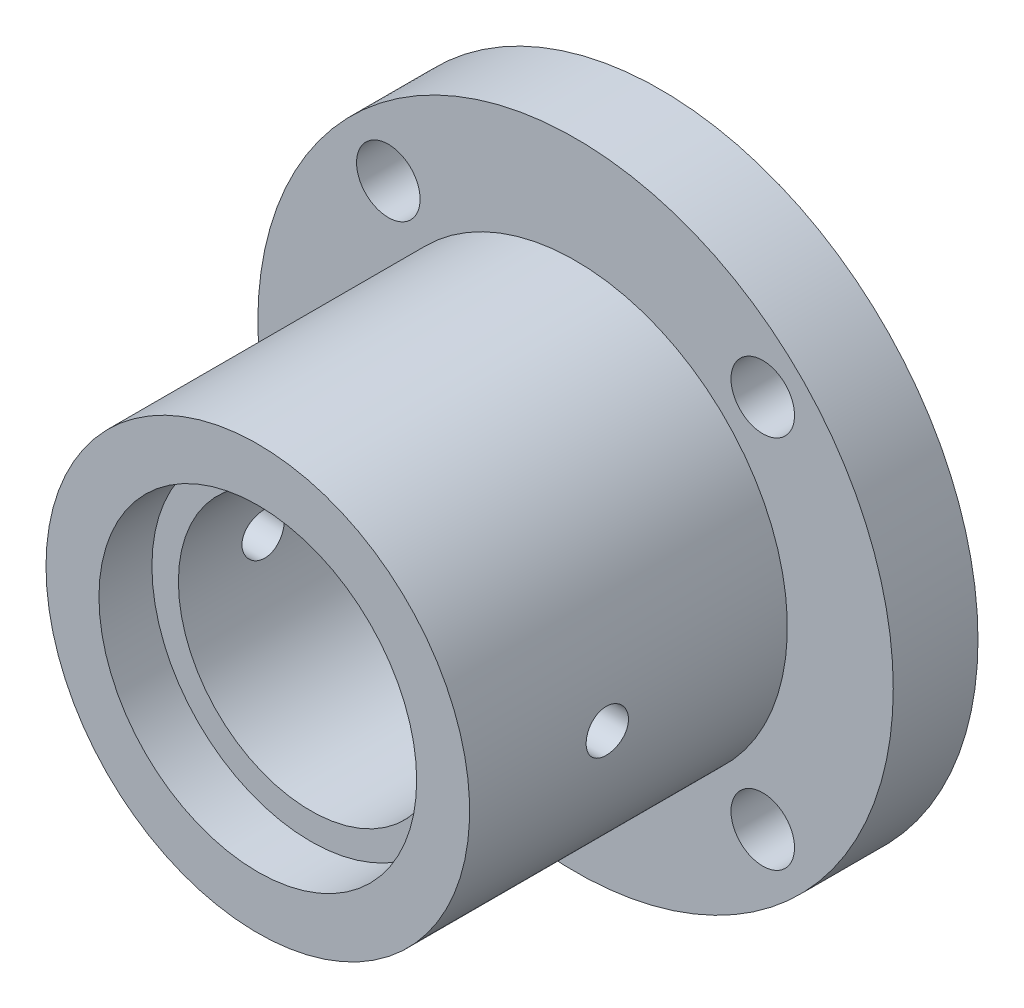
ISO-10303-21;
HEADER;
FILE_DESCRIPTION(('STEP AP214'),'2;1');
FILE_NAME('part.step','',(''),(''),'','','');
FILE_SCHEMA(('AUTOMOTIVE_DESIGN { 1 0 10303 214 1 1 1 1 }'));
ENDSEC;
DATA;
#1=APPLICATION_CONTEXT('core data for automotive mechanical design processes');
#2=APPLICATION_PROTOCOL_DEFINITION('international standard','automotive_design',2000,#1);
#3=PRODUCT_CONTEXT('',#1,'mechanical');
#4=PRODUCT('Part','Part','',(#3));
#5=PRODUCT_RELATED_PRODUCT_CATEGORY('part','',(#4));
#6=PRODUCT_DEFINITION_FORMATION('','',#4);
#7=PRODUCT_DEFINITION_CONTEXT('part definition',#1,'design');
#8=PRODUCT_DEFINITION('design','',#6,#7);
#9=PRODUCT_DEFINITION_SHAPE('','',#8);
#10=(LENGTH_UNIT() NAMED_UNIT(*) SI_UNIT(.MILLI.,.METRE.));
#11=(NAMED_UNIT(*) PLANE_ANGLE_UNIT() SI_UNIT($,.RADIAN.));
#12=(NAMED_UNIT(*) SI_UNIT($,.STERADIAN.) SOLID_ANGLE_UNIT());
#13=UNCERTAINTY_MEASURE_WITH_UNIT(LENGTH_MEASURE(1.E-05),#10,'distance_accuracy_value','');
#14=(GEOMETRIC_REPRESENTATION_CONTEXT(3) GLOBAL_UNCERTAINTY_ASSIGNED_CONTEXT((#13)) GLOBAL_UNIT_ASSIGNED_CONTEXT((#10,
#11,#12)) REPRESENTATION_CONTEXT('',''));
#15=CARTESIAN_POINT('',(0.,0.,0.));
#16=DIRECTION('',(0.,0.,1.));
#17=DIRECTION('',(1.,0.,0.));
#18=AXIS2_PLACEMENT_3D('',#15,#16,#17);
#19=CARTESIAN_POINT('',(0.,0.,0.));
#20=DIRECTION('',(0.,0.,1.));
#21=DIRECTION('',(1.,0.,0.));
#22=AXIS2_PLACEMENT_3D('',#19,#20,#21);
#23=PLANE('',#22);
#24=CARTESIAN_POINT('',(17.67767,-17.67767,0.));
#25=DIRECTION('',(0.,0.,1.));
#26=DIRECTION('',(1.,0.,0.));
#27=AXIS2_PLACEMENT_3D('',#24,#25,#26);
#28=CIRCLE('',#27,3.);
#29=CARTESIAN_POINT('',(20.67767,-17.67767,0.));
#30=VERTEX_POINT('',#29);
#31=EDGE_CURVE('E184',#30,#30,#28,.T.);
#32=ORIENTED_EDGE('',*,*,#31,.T.);
#33=EDGE_LOOP('',(#32));
#34=FACE_BOUND('',#33,.T.);
#35=CARTESIAN_POINT('',(-17.67767,-17.67767,0.));
#36=DIRECTION('',(0.,0.,1.));
#37=DIRECTION('',(1.,0.,0.));
#38=AXIS2_PLACEMENT_3D('',#35,#36,#37);
#39=CIRCLE('',#38,3.);
#40=CARTESIAN_POINT('',(-14.67767,-17.67767,0.));
#41=VERTEX_POINT('',#40);
#42=EDGE_CURVE('E188',#41,#41,#39,.T.);
#43=ORIENTED_EDGE('',*,*,#42,.T.);
#44=EDGE_LOOP('',(#43));
#45=FACE_BOUND('',#44,.T.);
#46=CARTESIAN_POINT('',(-17.67767,17.67767,0.));
#47=DIRECTION('',(0.,0.,1.));
#48=DIRECTION('',(1.,0.,0.));
#49=AXIS2_PLACEMENT_3D('',#46,#47,#48);
#50=CIRCLE('',#49,3.);
#51=CARTESIAN_POINT('',(-14.67767,17.67767,0.));
#52=VERTEX_POINT('',#51);
#53=EDGE_CURVE('E183',#52,#52,#50,.T.);
#54=ORIENTED_EDGE('',*,*,#53,.T.);
#55=EDGE_LOOP('',(#54));
#56=FACE_BOUND('',#55,.T.);
#57=CARTESIAN_POINT('',(17.67767,17.67767,0.));
#58=DIRECTION('',(0.,0.,1.));
#59=DIRECTION('',(1.,0.,0.));
#60=AXIS2_PLACEMENT_3D('',#57,#58,#59);
#61=CIRCLE('',#60,3.);
#62=CARTESIAN_POINT('',(20.67767,17.67767,0.));
#63=VERTEX_POINT('',#62);
#64=EDGE_CURVE('E85',#63,#63,#61,.T.);
#65=ORIENTED_EDGE('',*,*,#64,.T.);
#66=EDGE_LOOP('',(#65));
#67=FACE_BOUND('',#66,.T.);
#68=CARTESIAN_POINT('',(0.,0.,0.));
#69=DIRECTION('',(0.,0.,1.));
#70=DIRECTION('',(1.,0.,0.));
#71=AXIS2_PLACEMENT_3D('',#68,#69,#70);
#72=CIRCLE('',#71,12.5);
#73=CARTESIAN_POINT('',(12.5,0.,0.));
#74=VERTEX_POINT('',#73);
#75=EDGE_CURVE('E79',#74,#74,#72,.T.);
#76=ORIENTED_EDGE('',*,*,#75,.T.);
#77=EDGE_LOOP('',(#76));
#78=FACE_BOUND('',#77,.T.);
#79=CARTESIAN_POINT('',(0.,0.,0.));
#80=DIRECTION('',(0.,0.,-1.));
#81=DIRECTION('',(-1.,0.,0.));
#82=AXIS2_PLACEMENT_3D('',#79,#80,#81);
#83=CIRCLE('',#82,30.);
#84=CARTESIAN_POINT('',(-30.,0.,0.));
#85=VERTEX_POINT('',#84);
#86=EDGE_CURVE('E10',#85,#85,#83,.T.);
#87=ORIENTED_EDGE('',*,*,#86,.T.);
#88=EDGE_LOOP('',(#87));
#89=FACE_BOUND('',#88,.T.);
#90=ADVANCED_FACE('F49',(#34,#45,#56,#67,#78,#89),#23,.F.);
#91=CARTESIAN_POINT('',(0.,0.,0.));
#92=DIRECTION('',(0.,0.,-1.));
#93=DIRECTION('',(-1.,0.,0.));
#94=AXIS2_PLACEMENT_3D('',#91,#92,#93);
#95=CYLINDRICAL_SURFACE('',#94,30.);
#96=ORIENTED_EDGE('',*,*,#86,.F.);
#97=EDGE_LOOP('',(#96));
#98=FACE_BOUND('',#97,.T.);
#99=CARTESIAN_POINT('',(0.,0.,8.));
#100=DIRECTION('',(0.,0.,-1.));
#101=DIRECTION('',(-1.,0.,0.));
#102=AXIS2_PLACEMENT_3D('',#99,#100,#101);
#103=CIRCLE('',#102,30.);
#104=CARTESIAN_POINT('',(-30.,0.,8.));
#105=VERTEX_POINT('',#104);
#106=EDGE_CURVE('E63',#105,#105,#103,.T.);
#107=ORIENTED_EDGE('',*,*,#106,.T.);
#108=EDGE_LOOP('',(#107));
#109=FACE_BOUND('',#108,.T.);
#110=ADVANCED_FACE('F151',(#98,#109),#95,.T.);
#111=CARTESIAN_POINT('',(30.,0.,8.));
#112=DIRECTION('',(0.,0.,-1.));
#113=DIRECTION('',(-1.,0.,0.));
#114=AXIS2_PLACEMENT_3D('',#111,#112,#113);
#115=PLANE('',#114);
#116=CARTESIAN_POINT('',(17.67767,-17.67767,8.));
#117=DIRECTION('',(0.,0.,-1.));
#118=DIRECTION('',(-1.,0.,0.));
#119=AXIS2_PLACEMENT_3D('',#116,#117,#118);
#120=CIRCLE('',#119,3.);
#121=CARTESIAN_POINT('',(14.67767,-17.67767,8.));
#122=VERTEX_POINT('',#121);
#123=EDGE_CURVE('E93',#122,#122,#120,.F.);
#124=ORIENTED_EDGE('',*,*,#123,.F.);
#125=EDGE_LOOP('',(#124));
#126=FACE_BOUND('',#125,.T.);
#127=CARTESIAN_POINT('',(-17.67767,-17.67767,8.));
#128=DIRECTION('',(0.,0.,-1.));
#129=DIRECTION('',(-1.,0.,0.));
#130=AXIS2_PLACEMENT_3D('',#127,#128,#129);
#131=CIRCLE('',#130,3.);
#132=CARTESIAN_POINT('',(-20.67767,-17.67767,8.));
#133=VERTEX_POINT('',#132);
#134=EDGE_CURVE('E89',#133,#133,#131,.F.);
#135=ORIENTED_EDGE('',*,*,#134,.F.);
#136=EDGE_LOOP('',(#135));
#137=FACE_BOUND('',#136,.T.);
#138=CARTESIAN_POINT('',(-17.67767,17.67767,8.));
#139=DIRECTION('',(0.,0.,-1.));
#140=DIRECTION('',(-1.,0.,0.));
#141=AXIS2_PLACEMENT_3D('',#138,#139,#140);
#142=CIRCLE('',#141,3.);
#143=CARTESIAN_POINT('',(-20.67767,17.67767,8.));
#144=VERTEX_POINT('',#143);
#145=EDGE_CURVE('E84',#144,#144,#142,.F.);
#146=ORIENTED_EDGE('',*,*,#145,.F.);
#147=EDGE_LOOP('',(#146));
#148=FACE_BOUND('',#147,.T.);
#149=CARTESIAN_POINT('',(17.67767,17.67767,8.));
#150=DIRECTION('',(0.,0.,-1.));
#151=DIRECTION('',(-1.,0.,0.));
#152=AXIS2_PLACEMENT_3D('',#149,#150,#151);
#153=CIRCLE('',#152,3.);
#154=CARTESIAN_POINT('',(14.67767,17.67767,8.));
#155=VERTEX_POINT('',#154);
#156=EDGE_CURVE('E80',#155,#155,#153,.F.);
#157=ORIENTED_EDGE('',*,*,#156,.F.);
#158=EDGE_LOOP('',(#157));
#159=FACE_BOUND('',#158,.T.);
#160=ORIENTED_EDGE('',*,*,#106,.F.);
#161=EDGE_LOOP('',(#160));
#162=FACE_BOUND('',#161,.T.);
#163=CARTESIAN_POINT('',(0.,0.,8.));
#164=DIRECTION('',(0.,0.,-1.));
#165=DIRECTION('',(-1.,0.,0.));
#166=AXIS2_PLACEMENT_3D('',#163,#164,#165);
#167=CIRCLE('',#166,20.);
#168=CARTESIAN_POINT('',(-20.,0.,8.));
#169=VERTEX_POINT('',#168);
#170=EDGE_CURVE('E71',#169,#169,#167,.T.);
#171=ORIENTED_EDGE('',*,*,#170,.T.);
#172=EDGE_LOOP('',(#171));
#173=FACE_BOUND('',#172,.T.);
#174=ADVANCED_FACE('F145',(#126,#137,#148,#159,#162,#173),#115,.F.);
#175=CARTESIAN_POINT('',(0.,0.,0.));
#176=DIRECTION('',(0.,0.,-1.));
#177=DIRECTION('',(-1.,0.,0.));
#178=AXIS2_PLACEMENT_3D('',#175,#176,#177);
#179=CYLINDRICAL_SURFACE('',#178,20.);
#180=CARTESIAN_POINT('',(-20.,0.,27.));
#181=CARTESIAN_POINT('',(-19.9999987104154,-0.112040707583114,26.9999951481993));
#182=CARTESIAN_POINT('',(-19.9990485119241,-0.224155490335545,26.9905534622071));
#183=CARTESIAN_POINT('',(-19.9953493518948,-0.445276796993674,26.9530312594191));
#184=CARTESIAN_POINT('',(-19.9925984086805,-0.554279758337656,26.9249302079508));
#185=CARTESIAN_POINT('',(-19.9856082912614,-0.765943350906829,26.8509155188043));
#186=CARTESIAN_POINT('',(-19.9813700160142,-0.86860776922982,26.8050126389631));
#187=CARTESIAN_POINT('',(-19.9718791478861,-1.06475232192081,26.6967181841367));
#188=CARTESIAN_POINT('',(-19.9666267567626,-1.15823427755815,26.6343298879997));
#189=CARTESIAN_POINT('',(-19.9556748868265,-1.33371910134816,26.4945946046755));
#190=CARTESIAN_POINT('',(-19.9499740314773,-1.41568428966978,26.4172004011959));
#191=CARTESIAN_POINT('',(-19.9387791381252,-1.56548504286197,26.2497509314739));
#192=CARTESIAN_POINT('',(-19.9332851096983,-1.63331995416531,26.1596950799152));
#193=CARTESIAN_POINT('',(-19.9231118310557,-1.75306794088723,25.9692429366328));
#194=CARTESIAN_POINT('',(-19.9184343342181,-1.80494693090976,25.8688251118103));
#195=CARTESIAN_POINT('',(-19.9104407509305,-1.89109276948552,25.66064882819));
#196=CARTESIAN_POINT('',(-19.9071246308444,-1.92536005318258,25.5528905508321));
#197=CARTESIAN_POINT('',(-19.9022416814596,-1.97519808320379,25.333476398268));
#198=CARTESIAN_POINT('',(-19.9006690079619,-1.99083130600759,25.2218348462956));
#199=CARTESIAN_POINT('',(-19.8994328612105,-2.00315057027072,24.9975022732084));
#200=CARTESIAN_POINT('',(-19.8997693377749,-1.99983710974161,24.8848112797559));
#201=CARTESIAN_POINT('',(-19.9023081379787,-1.97440856050536,24.6620093806134));
#202=CARTESIAN_POINT('',(-19.904503691813,-1.9523616882491,24.5518906013426));
#203=CARTESIAN_POINT('',(-19.9105026857484,-1.89019828830117,24.3369240735978));
#204=CARTESIAN_POINT('',(-19.9143061475698,-1.85008151651149,24.2320763963499));
#205=CARTESIAN_POINT('',(-19.9231001890414,-1.75284178776302,24.0304128254022));
#206=CARTESIAN_POINT('',(-19.9280928781631,-1.69568856543996,23.9336116210214));
#207=CARTESIAN_POINT('',(-19.9387010346576,-1.56602005470646,23.7509495701762));
#208=CARTESIAN_POINT('',(-19.9443165202557,-1.49350431667301,23.6650890440365));
#209=CARTESIAN_POINT('',(-19.9555677062598,-1.33478822482414,23.5063492120219));
#210=CARTESIAN_POINT('',(-19.9612033866599,-1.24852895770273,23.4335287962384));
#211=CARTESIAN_POINT('',(-19.9718365815704,-1.06497896347423,23.3033927341792));
#212=CARTESIAN_POINT('',(-19.9768340953651,-0.967688223999202,23.246077105287));
#213=CARTESIAN_POINT('',(-19.9856295133419,-0.764796211384729,23.1485799593795));
#214=CARTESIAN_POINT('',(-19.9894272082954,-0.659193492779806,23.1084014303639));
#215=CARTESIAN_POINT('',(-19.9953929488282,-0.442694434659864,23.0463621665765));
#216=CARTESIAN_POINT('',(-19.9975610431413,-0.3317982535532,23.0245008840188));
#217=CARTESIAN_POINT('',(-20.0000170333662,-0.108370198183806,22.9997913845305));
#218=CARTESIAN_POINT('',(-20.0003129653547,0.00415260421098516,22.996861903495));
#219=CARTESIAN_POINT('',(-19.9990128351359,0.228087586631401,23.0098857260975));
#220=CARTESIAN_POINT('',(-19.9974167984894,0.339499781640941,23.0258387746306));
#221=CARTESIAN_POINT('',(-19.9925172307839,0.557816413669351,23.0761073908432));
#222=CARTESIAN_POINT('',(-19.9892172383608,0.66472969794404,23.110384908956));
#223=CARTESIAN_POINT('',(-19.9812799772122,0.871288642767564,23.1962903480745));
#224=CARTESIAN_POINT('',(-19.9766426785051,0.970934140314235,23.2479186580788));
#225=CARTESIAN_POINT('',(-19.9665295066084,1.16049636034429,23.3672616773278));
#226=CARTESIAN_POINT('',(-19.9610508720688,1.25037931949784,23.4350297778516));
#227=CARTESIAN_POINT('',(-19.9498786573904,1.41752324662376,23.5846521354819));
#228=CARTESIAN_POINT('',(-19.9441850718594,1.49478389769835,23.6665067461406));
#229=CARTESIAN_POINT('',(-19.9332004828151,1.63477221977429,23.842333149318));
#230=CARTESIAN_POINT('',(-19.9279110027795,1.69744655735909,23.9363475130852));
#231=CARTESIAN_POINT('',(-19.9183566492178,1.80611651748766,24.1336147202934));
#232=CARTESIAN_POINT('',(-19.9140917616808,1.85211236810777,24.2368674373768));
#233=CARTESIAN_POINT('',(-19.907078952681,1.92603041736895,24.4494974789316));
#234=CARTESIAN_POINT('',(-19.9043283689958,1.95398434962372,24.5588636801822));
#235=CARTESIAN_POINT('',(-19.9006473056575,1.99112801425893,24.7807663959215));
#236=CARTESIAN_POINT('',(-19.8997167738037,2.00031828479904,24.8933028193913));
#237=CARTESIAN_POINT('',(-19.8997822621512,1.99966627694251,25.1178213767134));
#238=CARTESIAN_POINT('',(-19.9007698017402,1.98990777918623,25.2298037657656));
#239=CARTESIAN_POINT('',(-19.9045420777909,1.95181090592731,25.4505298343366));
#240=CARTESIAN_POINT('',(-19.9073268162744,1.92347250952432,25.559273510212));
#241=CARTESIAN_POINT('',(-19.9143773652637,1.84904337259501,25.7704346980957));
#242=CARTESIAN_POINT('',(-19.9186429708072,1.80295508868183,25.8728530832595));
#243=CARTESIAN_POINT('',(-19.9281750367872,1.69434310982209,26.0685137833421));
#244=CARTESIAN_POINT('',(-19.933441491619,1.63181950691083,26.1617561496413));
#245=CARTESIAN_POINT('',(-19.944409744194,1.49179711257066,26.3368473489439));
#246=CARTESIAN_POINT('',(-19.950113294535,1.41423589778053,26.4186461527342));
#247=CARTESIAN_POINT('',(-19.9612970945757,1.24646339845022,26.5681044653993));
#248=CARTESIAN_POINT('',(-19.9667772904595,1.15624908821651,26.6357605827143));
#249=CARTESIAN_POINT('',(-19.9769112413832,0.965482868322578,26.7551469077092));
#250=CARTESIAN_POINT('',(-19.9815628805362,0.864905498693527,26.8068365818904));
#251=CARTESIAN_POINT('',(-19.9894925849979,0.656516558201101,26.8925248456477));
#252=CARTESIAN_POINT('',(-19.9927721981931,0.548713299651219,26.9265433819071));
#253=CARTESIAN_POINT('',(-19.9967642754747,0.366916522811409,26.9674412341696));
#254=CARTESIAN_POINT('',(-19.9979720138367,0.294085105689017,26.9796340885987));
#255=CARTESIAN_POINT('',(-19.9995902990157,0.147513161634625,26.9959150521235));
#256=CARTESIAN_POINT('',(-20.0000008491205,0.0737726384531154,27.0000031946437));
#257=CARTESIAN_POINT('',(-20.,0.,27.));
#258=B_SPLINE_CURVE_WITH_KNOTS('',3,(#180,#181,#182,#183,#184,#185,#186,#187,#188,#189,#190,
#191,#192,#193,#194,#195,#196,#197,#198,#199,#200,#201,#202,#203,#204,#205,#206,#207,#208,#209,
#210,#211,#212,#213,#214,#215,#216,#217,#218,#219,#220,#221,#222,#223,#224,#225,#226,#227,#228,
#229,#230,#231,#232,#233,#234,#235,#236,#237,#238,#239,#240,#241,#242,#243,#244,#245,#246,#247,
#248,#249,#250,#251,#252,#253,#254,#255,#256,#257),.UNSPECIFIED.,.T.,.F.,(4,2,2,2,2,2,2,2,2,2,2,
2,2,2,2,2,2,2,2,2,2,2,2,2,2,2,2,2,2,2,2,2,2,2,2,2,2,2,4),(0.,0.335852732536947,
0.672075685670974,1.00809577146441,1.34404907516557,1.68107713724589,2.01812078441412,
2.35587950944444,2.69362988885008,3.03024464090393,3.36685054511553,3.70223594882221,
4.03762588323268,4.3736152274579,4.70961440662251,5.04709468392414,5.38457533959544,
5.72211481387164,6.0596441935088,6.39572377215516,6.73179881038287,7.0671787058861,
7.40256612098934,7.73907881497398,8.0755999562046,8.41333287217198,8.75106116950749,
9.08819381186007,9.42531678479171,9.76095258587914,10.0965887645208,10.432178507256,
10.7677663707792,11.1047783485531,11.4418710527392,11.7798126205249,12.1173718959059,
12.338513344647,12.5596538813806),.UNSPECIFIED.);
#259=CARTESIAN_POINT('',(-20.,0.,27.));
#260=VERTEX_POINT('',#259);
#261=EDGE_CURVE('E131',#260,#260,#258,.T.);
#262=ORIENTED_EDGE('',*,*,#261,.T.);
#263=EDGE_LOOP('',(#262));
#264=FACE_BOUND('',#263,.T.);
#265=CARTESIAN_POINT('',(20.,0.,23.));
#266=CARTESIAN_POINT('',(19.9999987104154,-0.112040707583115,23.0000048518008));
#267=CARTESIAN_POINT('',(19.9990485119241,-0.224155490335546,23.0094465377929));
#268=CARTESIAN_POINT('',(19.9953493518948,-0.445276796993675,23.0469687405809));
#269=CARTESIAN_POINT('',(19.9925984086805,-0.554279758337657,23.0750697920492));
#270=CARTESIAN_POINT('',(19.9856082912614,-0.765943350906829,23.1490844811957));
#271=CARTESIAN_POINT('',(19.9813700160142,-0.868607769229819,23.1949873610369));
#272=CARTESIAN_POINT('',(19.9718791478861,-1.06475232192081,23.3032818158633));
#273=CARTESIAN_POINT('',(19.9666267567626,-1.15823427755816,23.3656701120003));
#274=CARTESIAN_POINT('',(19.9556748868265,-1.33371910134817,23.5054053953246));
#275=CARTESIAN_POINT('',(19.9499740314773,-1.41568428966979,23.5827995988041));
#276=CARTESIAN_POINT('',(19.9387791381252,-1.56548504286197,23.7502490685261));
#277=CARTESIAN_POINT('',(19.9332851096983,-1.63331995416531,23.8403049200848));
#278=CARTESIAN_POINT('',(19.9231118310557,-1.75306794088724,24.0307570633672));
#279=CARTESIAN_POINT('',(19.9184343342181,-1.80494693090976,24.1311748881897));
#280=CARTESIAN_POINT('',(19.9104407509305,-1.89109276948552,24.33935117181));
#281=CARTESIAN_POINT('',(19.9071246308444,-1.92536005318258,24.4471094491679));
#282=CARTESIAN_POINT('',(19.9022416814596,-1.97519808320379,24.666523601732));
#283=CARTESIAN_POINT('',(19.9006690079619,-1.99083130600759,24.7781651537044));
#284=CARTESIAN_POINT('',(19.8994328612105,-2.00315057027072,25.0024977267916));
#285=CARTESIAN_POINT('',(19.8997693377749,-1.9998371097416,25.1151887202441));
#286=CARTESIAN_POINT('',(19.9023081379787,-1.97440856050536,25.3379906193866));
#287=CARTESIAN_POINT('',(19.904503691813,-1.95236168824911,25.4481093986574));
#288=CARTESIAN_POINT('',(19.9105026857484,-1.89019828830117,25.6630759264022));
#289=CARTESIAN_POINT('',(19.9143061475698,-1.85008151651149,25.7679236036501));
#290=CARTESIAN_POINT('',(19.9231001890414,-1.75284178776302,25.9695871745978));
#291=CARTESIAN_POINT('',(19.9280928781631,-1.69568856543996,26.0663883789786));
#292=CARTESIAN_POINT('',(19.9387010346576,-1.56602005470646,26.2490504298238));
#293=CARTESIAN_POINT('',(19.9443165202557,-1.49350431667301,26.3349109559635));
#294=CARTESIAN_POINT('',(19.9555677062598,-1.33478822482414,26.4936507879781));
#295=CARTESIAN_POINT('',(19.9612033866599,-1.24852895770273,26.5664712037616));
#296=CARTESIAN_POINT('',(19.9718365815704,-1.06497896347423,26.6966072658208));
#297=CARTESIAN_POINT('',(19.9768340953651,-0.967688223999204,26.753922894713));
#298=CARTESIAN_POINT('',(19.9856295133419,-0.76479621138473,26.8514200406205));
#299=CARTESIAN_POINT('',(19.9894272082954,-0.659193492779807,26.8915985696361));
#300=CARTESIAN_POINT('',(19.9953929488282,-0.442694434659864,26.9536378334235));
#301=CARTESIAN_POINT('',(19.9975610431413,-0.331798253553201,26.9754991159813));
#302=CARTESIAN_POINT('',(20.0000170333662,-0.108370198183808,27.0002086154695));
#303=CARTESIAN_POINT('',(20.0003129653547,0.0041526042109832,27.003138096505));
#304=CARTESIAN_POINT('',(19.9990128351359,0.228087586631399,26.9901142739025));
#305=CARTESIAN_POINT('',(19.9974167984894,0.339499781640939,26.9741612253694));
#306=CARTESIAN_POINT('',(19.9925172307839,0.557816413669349,26.9238926091568));
#307=CARTESIAN_POINT('',(19.9892172383608,0.664729697944038,26.889615091044));
#308=CARTESIAN_POINT('',(19.9812799772122,0.871288642767563,26.8037096519255));
#309=CARTESIAN_POINT('',(19.9766426785051,0.970934140314235,26.7520813419212));
#310=CARTESIAN_POINT('',(19.9665295066084,1.16049636034429,26.6327383226722));
#311=CARTESIAN_POINT('',(19.9610508720688,1.25037931949784,26.5649702221484));
#312=CARTESIAN_POINT('',(19.9498786573904,1.41752324662376,26.4153478645181));
#313=CARTESIAN_POINT('',(19.9441850718594,1.49478389769835,26.3334932538594));
#314=CARTESIAN_POINT('',(19.9332004828151,1.63477221977429,26.157666850682));
#315=CARTESIAN_POINT('',(19.9279110027795,1.69744655735909,26.0636524869148));
#316=CARTESIAN_POINT('',(19.9183566492178,1.80611651748766,25.8663852797066));
#317=CARTESIAN_POINT('',(19.9140917616808,1.85211236810777,25.7631325626232));
#318=CARTESIAN_POINT('',(19.907078952681,1.92603041736895,25.5505025210684));
#319=CARTESIAN_POINT('',(19.9043283689958,1.95398434962372,25.4411363198178));
#320=CARTESIAN_POINT('',(19.9006473056575,1.99112801425893,25.2192336040785));
#321=CARTESIAN_POINT('',(19.8997167738037,2.00031828479904,25.1066971806086));
#322=CARTESIAN_POINT('',(19.8997822621512,1.99966627694251,24.8821786232866));
#323=CARTESIAN_POINT('',(19.9007698017402,1.98990777918623,24.7701962342344));
#324=CARTESIAN_POINT('',(19.9045420777909,1.95181090592731,24.5494701656634));
#325=CARTESIAN_POINT('',(19.9073268162744,1.92347250952432,24.440726489788));
#326=CARTESIAN_POINT('',(19.9143773652637,1.84904337259501,24.2295653019043));
#327=CARTESIAN_POINT('',(19.9186429708072,1.80295508868183,24.1271469167406));
#328=CARTESIAN_POINT('',(19.9281750367872,1.69434310982209,23.9314862166579));
#329=CARTESIAN_POINT('',(19.933441491619,1.63181950691083,23.8382438503587));
#330=CARTESIAN_POINT('',(19.944409744194,1.49179711257066,23.6631526510561));
#331=CARTESIAN_POINT('',(19.950113294535,1.41423589778054,23.5813538472658));
#332=CARTESIAN_POINT('',(19.9612970945757,1.24646339845022,23.4318955346007));
#333=CARTESIAN_POINT('',(19.9667772904595,1.15624908821652,23.3642394172857));
#334=CARTESIAN_POINT('',(19.9769112413832,0.965482868322581,23.2448530922908));
#335=CARTESIAN_POINT('',(19.9815628805362,0.86490549869353,23.1931634181096));
#336=CARTESIAN_POINT('',(19.9894925849979,0.656516558201104,23.1074751543523));
#337=CARTESIAN_POINT('',(19.9927721981931,0.548713299651222,23.0734566180929));
#338=CARTESIAN_POINT('',(19.9967642754747,0.366916522811411,23.0325587658304));
#339=CARTESIAN_POINT('',(19.9979720138367,0.294085105689019,23.0203659114013));
#340=CARTESIAN_POINT('',(19.9995902990157,0.147513161634626,23.0040849478765));
#341=CARTESIAN_POINT('',(20.0000008491205,0.073772638453116,22.9999968053563));
#342=CARTESIAN_POINT('',(20.,0.,23.));
#343=B_SPLINE_CURVE_WITH_KNOTS('',3,(#265,#266,#267,#268,#269,#270,#271,#272,#273,#274,#275,
#276,#277,#278,#279,#280,#281,#282,#283,#284,#285,#286,#287,#288,#289,#290,#291,#292,#293,#294,
#295,#296,#297,#298,#299,#300,#301,#302,#303,#304,#305,#306,#307,#308,#309,#310,#311,#312,#313,
#314,#315,#316,#317,#318,#319,#320,#321,#322,#323,#324,#325,#326,#327,#328,#329,#330,#331,#332,
#333,#334,#335,#336,#337,#338,#339,#340,#341,#342),.UNSPECIFIED.,.T.,.F.,(4,2,2,2,2,2,2,2,2,2,2,
2,2,2,2,2,2,2,2,2,2,2,2,2,2,2,2,2,2,2,2,2,2,2,2,2,2,2,4),(0.,0.335852732536947,
0.672075685670974,1.0080957714644,1.34404907516557,1.6810771372459,2.01812078441412,
2.35587950944444,2.69362988885008,3.03024464090394,3.36685054511554,3.70223594882222,
4.03762588323268,4.3736152274579,4.70961440662251,5.04709468392413,5.38457533959544,
5.72211481387163,6.05964419350879,6.39572377215516,6.73179881038287,7.0671787058861,
7.40256612098934,7.73907881497397,8.0755999562046,8.41333287217197,8.75106116950749,
9.08819381186006,9.42531678479171,9.76095258587913,10.0965887645208,10.432178507256,
10.7677663707792,11.1047783485531,11.4418710527392,11.7798126205249,12.1173718959059,
12.338513344647,12.5596538813805),.UNSPECIFIED.);
#344=CARTESIAN_POINT('',(20.,0.,23.));
#345=VERTEX_POINT('',#344);
#346=EDGE_CURVE('E124',#345,#345,#343,.T.);
#347=ORIENTED_EDGE('',*,*,#346,.T.);
#348=EDGE_LOOP('',(#347));
#349=FACE_BOUND('',#348,.T.);
#350=ORIENTED_EDGE('',*,*,#170,.F.);
#351=EDGE_LOOP('',(#350));
#352=FACE_BOUND('',#351,.T.);
#353=CARTESIAN_POINT('',(0.,0.,38.));
#354=DIRECTION('',(0.,0.,-1.));
#355=DIRECTION('',(-1.,0.,0.));
#356=AXIS2_PLACEMENT_3D('',#353,#354,#355);
#357=CIRCLE('',#356,20.);
#358=CARTESIAN_POINT('',(-20.,0.,38.));
#359=VERTEX_POINT('',#358);
#360=EDGE_CURVE('E166',#359,#359,#357,.T.);
#361=ORIENTED_EDGE('',*,*,#360,.T.);
#362=EDGE_LOOP('',(#361));
#363=FACE_BOUND('',#362,.T.);
#364=ADVANCED_FACE('F137',(#264,#349,#352,#363),#179,.T.);
#365=CARTESIAN_POINT('',(20.,0.,38.));
#366=DIRECTION('',(0.,0.,-1.));
#367=DIRECTION('',(-1.,0.,0.));
#368=AXIS2_PLACEMENT_3D('',#365,#366,#367);
#369=PLANE('',#368);
#370=CARTESIAN_POINT('',(0.,0.,38.));
#371=DIRECTION('',(0.,0.,1.));
#372=DIRECTION('',(1.,0.,0.));
#373=AXIS2_PLACEMENT_3D('',#370,#371,#372);
#374=CIRCLE('',#373,15.);
#375=CARTESIAN_POINT('',(15.,0.,38.));
#376=VERTEX_POINT('',#375);
#377=EDGE_CURVE('E78',#376,#376,#374,.T.);
#378=ORIENTED_EDGE('',*,*,#377,.F.);
#379=EDGE_LOOP('',(#378));
#380=FACE_BOUND('',#379,.T.);
#381=ORIENTED_EDGE('',*,*,#360,.F.);
#382=EDGE_LOOP('',(#381));
#383=FACE_BOUND('',#382,.T.);
#384=ADVANCED_FACE('F144',(#380,#383),#369,.F.);
#385=CARTESIAN_POINT('',(0.,0.,33.));
#386=DIRECTION('',(0.,0.,1.));
#387=DIRECTION('',(1.,0.,0.));
#388=AXIS2_PLACEMENT_3D('',#385,#386,#387);
#389=CYLINDRICAL_SURFACE('',#388,15.);
#390=CARTESIAN_POINT('',(0.,0.,33.));
#391=DIRECTION('',(0.,0.,1.));
#392=DIRECTION('',(1.,0.,0.));
#393=AXIS2_PLACEMENT_3D('',#390,#391,#392);
#394=CIRCLE('',#393,15.);
#395=CARTESIAN_POINT('',(15.,0.,33.));
#396=VERTEX_POINT('',#395);
#397=EDGE_CURVE('E169',#396,#396,#394,.T.);
#398=ORIENTED_EDGE('',*,*,#397,.F.);
#399=EDGE_LOOP('',(#398));
#400=FACE_BOUND('',#399,.T.);
#401=ORIENTED_EDGE('',*,*,#377,.T.);
#402=EDGE_LOOP('',(#401));
#403=FACE_BOUND('',#402,.T.);
#404=ADVANCED_FACE('F305',(#400,#403),#389,.F.);
#405=CARTESIAN_POINT('',(0.,0.,33.));
#406=DIRECTION('',(0.,0.,1.));
#407=DIRECTION('',(1.,0.,0.));
#408=AXIS2_PLACEMENT_3D('',#405,#406,#407);
#409=PLANE('',#408);
#410=CARTESIAN_POINT('',(0.,0.,33.));
#411=DIRECTION('',(0.,0.,1.));
#412=DIRECTION('',(1.,0.,0.));
#413=AXIS2_PLACEMENT_3D('',#410,#411,#412);
#414=CIRCLE('',#413,12.5);
#415=CARTESIAN_POINT('',(12.5,0.,33.));
#416=VERTEX_POINT('',#415);
#417=EDGE_CURVE('E75',#416,#416,#414,.T.);
#418=ORIENTED_EDGE('',*,*,#417,.F.);
#419=EDGE_LOOP('',(#418));
#420=FACE_BOUND('',#419,.T.);
#421=ORIENTED_EDGE('',*,*,#397,.T.);
#422=EDGE_LOOP('',(#421));
#423=FACE_BOUND('',#422,.T.);
#424=ADVANCED_FACE('F210',(#420,#423),#409,.T.);
#425=CARTESIAN_POINT('',(0.,0.,0.));
#426=DIRECTION('',(0.,0.,1.));
#427=DIRECTION('',(1.,0.,0.));
#428=AXIS2_PLACEMENT_3D('',#425,#426,#427);
#429=CYLINDRICAL_SURFACE('',#428,12.5);
#430=CARTESIAN_POINT('',(12.5,0.,23.));
#431=CARTESIAN_POINT('',(12.4999981342099,0.111577020127934,23.0000045286302));
#432=CARTESIAN_POINT('',(12.4984904676373,0.223216523860335,23.0093686072932));
#433=CARTESIAN_POINT('',(12.4926212341856,0.44336877965824,23.046564447698));
#434=CARTESIAN_POINT('',(12.4882569793104,0.551878486135175,23.0744136039001));
#435=CARTESIAN_POINT('',(12.4771644640129,0.762553771126289,23.147720880446));
#436=CARTESIAN_POINT('',(12.4704380773984,0.864724302944007,23.1931650461208));
#437=CARTESIAN_POINT('',(12.4553623980115,1.05997584434546,23.3003367943978));
#438=CARTESIAN_POINT('',(12.4470133072085,1.15305798294893,23.3620623508836));
#439=CARTESIAN_POINT('',(12.4295364290338,1.32832749604675,23.5006256042624));
#440=CARTESIAN_POINT('',(12.4204030044304,1.41042286652598,23.5775789789452));
#441=CARTESIAN_POINT('',(12.4024303990938,1.56059410283783,23.744164467275));
#442=CARTESIAN_POINT('',(12.393591236265,1.62866911690709,23.8337973506687));
#443=CARTESIAN_POINT('',(12.377153335782,1.74923165413214,24.0238238861521));
#444=CARTESIAN_POINT('',(12.369561883485,1.80162899846097,24.1242754373616));
#445=CARTESIAN_POINT('',(12.3565566594955,1.88877230962607,24.3326956628688));
#446=CARTESIAN_POINT('',(12.3511427525034,1.92351937318009,24.4406638696375));
#447=CARTESIAN_POINT('',(12.3431614474236,1.97408758681328,24.6600803768648));
#448=CARTESIAN_POINT('',(12.3405702530036,1.990067044504,24.77149131095));
#449=CARTESIAN_POINT('',(12.3384556715911,2.00313711337577,24.9954409870854));
#450=CARTESIAN_POINT('',(12.3389320844424,2.00022895694193,25.1079796550745));
#451=CARTESIAN_POINT('',(12.3428771480604,1.97573547058135,25.3298650304989));
#452=CARTESIAN_POINT('',(12.3463174079177,1.95432734726415,25.439231877361));
#453=CARTESIAN_POINT('',(12.3557581320174,1.89371943513841,25.652801071098));
#454=CARTESIAN_POINT('',(12.36175867776,1.85451907995672,25.7570032534509));
#455=CARTESIAN_POINT('',(12.375674818266,1.75925788747207,25.9578192678559));
#456=CARTESIAN_POINT('',(12.3835988093069,1.7031228581751,26.0543972996854));
#457=CARTESIAN_POINT('',(12.4004630811492,1.57563852632363,26.2368302716853));
#458=CARTESIAN_POINT('',(12.4094034376511,1.50428809015537,26.3226844121232));
#459=CARTESIAN_POINT('',(12.4274181245254,1.34742984087892,26.4822588004373));
#460=CARTESIAN_POINT('',(12.4364928200271,1.261769855456,26.5558295070688));
#461=CARTESIAN_POINT('',(12.4536592708467,1.07924037468053,26.687574738843));
#462=CARTESIAN_POINT('',(12.4617510207175,0.982370817216384,26.7457491786701));
#463=CARTESIAN_POINT('',(12.4760500569944,0.780035888309124,26.845061678114));
#464=CARTESIAN_POINT('',(12.4822559575706,0.674564267421535,26.8861872172689));
#465=CARTESIAN_POINT('',(12.492072755936,0.458089833939773,26.950099357926));
#466=CARTESIAN_POINT('',(12.4956838535962,0.347087448070733,26.9728873719371));
#467=CARTESIAN_POINT('',(12.4998774645506,0.123992055401972,26.999276470013));
#468=CARTESIAN_POINT('',(12.5004923996757,0.0119239336604398,27.0030829659577));
#469=CARTESIAN_POINT('',(12.4987129750933,-0.211249371511142,26.9919476183907));
#470=CARTESIAN_POINT('',(12.4963187218055,-0.322354588854288,26.9770064378887));
#471=CARTESIAN_POINT('',(12.4888100015234,-0.539818798235508,26.9289707018108));
#472=CARTESIAN_POINT('',(12.4837106780256,-0.646200674402083,26.8959771746955));
#473=CARTESIAN_POINT('',(12.4713614614776,-0.851922990585996,26.81288053147));
#474=CARTESIAN_POINT('',(12.4641114556453,-0.951263060991194,26.7627765180619));
#475=CARTESIAN_POINT('',(12.4481852151843,-1.14097865112887,26.6464060006967));
#476=CARTESIAN_POINT('',(12.4394977755831,-1.23127400309571,26.5800103639769));
#477=CARTESIAN_POINT('',(12.4216959541371,-1.39951415639529,26.4331198456375));
#478=CARTESIAN_POINT('',(12.4125815438834,-1.47745813440283,26.3526240248717));
#479=CARTESIAN_POINT('',(12.3948490273073,-1.61953866530001,26.178899611896));
#480=CARTESIAN_POINT('',(12.3862364645378,-1.6835368741472,26.0855572212132));
#481=CARTESIAN_POINT('',(12.3705841030174,-1.7949448921012,25.8893262188797));
#482=CARTESIAN_POINT('',(12.3635442573346,-1.84235519623835,25.7864378922229));
#483=CARTESIAN_POINT('',(12.3518754120478,-1.91903158354154,25.5744330407818));
#484=CARTESIAN_POINT('',(12.3472370587722,-1.94836814902516,25.4653425454021));
#485=CARTESIAN_POINT('',(12.3408723222072,-1.9882871855446,25.243702430008));
#486=CARTESIAN_POINT('',(12.3391457074239,-1.99887114748455,25.1311530857092));
#487=CARTESIAN_POINT('',(12.3388093758569,-2.00094546618394,24.9071705065634));
#488=CARTESIAN_POINT('',(12.3401641282165,-1.99265347821447,24.7957392804602));
#489=CARTESIAN_POINT('',(12.3457602825821,-1.95768017972975,24.5758786773728));
#490=CARTESIAN_POINT('',(12.3500016772787,-1.93099891577862,24.4674492927881));
#491=CARTESIAN_POINT('',(12.3608801586201,-1.86008521855063,24.2567446499835));
#492=CARTESIAN_POINT('',(12.3675148843103,-1.81587007770134,24.1544634423587));
#493=CARTESIAN_POINT('',(12.3824349767408,-1.71116577284244,23.9587355323269));
#494=CARTESIAN_POINT('',(12.3907204147391,-1.65067590624507,23.8652892115618));
#495=CARTESIAN_POINT('',(12.4081216807701,-1.51435663599677,23.6887814191635));
#496=CARTESIAN_POINT('',(12.417245602178,-1.43836664580959,23.6058447520996));
#497=CARTESIAN_POINT('',(12.4352300129975,-1.27354334357953,23.4538246186025));
#498=CARTESIAN_POINT('',(12.44409044097,-1.18470706402005,23.3847443618513));
#499=CARTESIAN_POINT('',(12.4606140562915,-0.996048346577335,23.2620025338282));
#500=CARTESIAN_POINT('',(12.4682693265296,-0.896160049794848,23.2084411261126));
#501=CARTESIAN_POINT('',(12.4814428750468,-0.688725166968656,23.1189387071009));
#502=CARTESIAN_POINT('',(12.4869633156233,-0.581186461209755,23.082979856896));
#503=CARTESIAN_POINT('',(12.4940175589639,-0.394335518838041,23.0376542612645));
#504=CARTESIAN_POINT('',(12.4962491778317,-0.316163477498693,23.0235560972072));
#505=CARTESIAN_POINT('',(12.4992410506714,-0.158671480151704,23.0047274271364));
#506=CARTESIAN_POINT('',(12.5000013269159,-0.0793515415388276,22.9999967793208));
#507=CARTESIAN_POINT('',(12.5,0.,23.));
#508=B_SPLINE_CURVE_WITH_KNOTS('',3,(#430,#431,#432,#433,#434,#435,#436,#437,#438,#439,#440,
#441,#442,#443,#444,#445,#446,#447,#448,#449,#450,#451,#452,#453,#454,#455,#456,#457,#458,#459,
#460,#461,#462,#463,#464,#465,#466,#467,#468,#469,#470,#471,#472,#473,#474,#475,#476,#477,#478,
#479,#480,#481,#482,#483,#484,#485,#486,#487,#488,#489,#490,#491,#492,#493,#494,#495,#496,#497,
#498,#499,#500,#501,#502,#503,#504,#505,#506,#507),.UNSPECIFIED.,.T.,.F.,(4,2,2,2,2,2,2,2,2,2,2,
2,2,2,2,2,2,2,2,2,2,2,2,2,2,2,2,2,2,2,2,2,2,2,2,2,2,2,4),(0.,0.334441046622946,
0.669197249319467,1.00368849765685,1.33813814029104,1.67523334608234,2.01234902501281,
2.35136809625946,2.69036609964138,3.0264835846965,3.36257913887026,3.695490558905,
4.02841257712192,4.36281487068318,4.69724208737484,5.03548313337389,5.37372605363721,
5.71221693636019,6.05068174320194,6.38547572150114,6.72025786018135,7.05318530227048,
7.38613020622257,7.72180459283845,8.05750134563271,8.39639027086604,8.73526908182521,
9.07281785760315,9.41033979575028,9.74398956846142,10.0776384963298,10.4109591848676,
10.7442942653299,11.0812763085405,11.4183363199473,11.7575256865024,12.0963705940352,
12.3342225666999,12.5720709388195),.UNSPECIFIED.);
#509=CARTESIAN_POINT('',(12.5,0.,23.));
#510=VERTEX_POINT('',#509);
#511=EDGE_CURVE('E53',#510,#510,#508,.T.);
#512=ORIENTED_EDGE('',*,*,#511,.T.);
#513=EDGE_LOOP('',(#512));
#514=FACE_BOUND('',#513,.T.);
#515=CARTESIAN_POINT('',(-12.5,0.,23.));
#516=CARTESIAN_POINT('',(-12.4999981342099,-0.111577020127934,23.0000045286302));
#517=CARTESIAN_POINT('',(-12.4984904676373,-0.223216523860335,23.0093686072932));
#518=CARTESIAN_POINT('',(-12.4926212341856,-0.443368779658238,23.046564447698));
#519=CARTESIAN_POINT('',(-12.4882569793104,-0.551878486135173,23.0744136039001));
#520=CARTESIAN_POINT('',(-12.4771644640129,-0.762553771126288,23.147720880446));
#521=CARTESIAN_POINT('',(-12.4704380773984,-0.864724302944005,23.1931650461208));
#522=CARTESIAN_POINT('',(-12.4553623980115,-1.05997584434546,23.3003367943978));
#523=CARTESIAN_POINT('',(-12.4470133072085,-1.15305798294893,23.3620623508836));
#524=CARTESIAN_POINT('',(-12.4295364290338,-1.32832749604674,23.5006256042624));
#525=CARTESIAN_POINT('',(-12.4204030044304,-1.41042286652597,23.5775789789452));
#526=CARTESIAN_POINT('',(-12.4024303990938,-1.56059410283783,23.744164467275));
#527=CARTESIAN_POINT('',(-12.393591236265,-1.62866911690709,23.8337973506687));
#528=CARTESIAN_POINT('',(-12.377153335782,-1.74923165413214,24.0238238861521));
#529=CARTESIAN_POINT('',(-12.369561883485,-1.80162899846096,24.1242754373616));
#530=CARTESIAN_POINT('',(-12.3565566594955,-1.88877230962607,24.3326956628688));
#531=CARTESIAN_POINT('',(-12.3511427525034,-1.92351937318009,24.4406638696375));
#532=CARTESIAN_POINT('',(-12.3431614474236,-1.97408758681328,24.6600803768648));
#533=CARTESIAN_POINT('',(-12.3405702530036,-1.990067044504,24.77149131095));
#534=CARTESIAN_POINT('',(-12.3384556715911,-2.00313711337577,24.9954409870854));
#535=CARTESIAN_POINT('',(-12.3389320844424,-2.00022895694193,25.1079796550745));
#536=CARTESIAN_POINT('',(-12.3428771480604,-1.97573547058135,25.3298650304989));
#537=CARTESIAN_POINT('',(-12.3463174079177,-1.95432734726415,25.439231877361));
#538=CARTESIAN_POINT('',(-12.3557581320174,-1.89371943513841,25.652801071098));
#539=CARTESIAN_POINT('',(-12.36175867776,-1.85451907995672,25.7570032534509));
#540=CARTESIAN_POINT('',(-12.375674818266,-1.75925788747207,25.9578192678559));
#541=CARTESIAN_POINT('',(-12.3835988093069,-1.70312285817509,26.0543972996854));
#542=CARTESIAN_POINT('',(-12.4004630811492,-1.57563852632363,26.2368302716853));
#543=CARTESIAN_POINT('',(-12.4094034376511,-1.50428809015537,26.3226844121232));
#544=CARTESIAN_POINT('',(-12.4274181245254,-1.34742984087892,26.4822588004374));
#545=CARTESIAN_POINT('',(-12.4364928200271,-1.26176985545599,26.5558295070688));
#546=CARTESIAN_POINT('',(-12.4536592708467,-1.07924037468052,26.687574738843));
#547=CARTESIAN_POINT('',(-12.4617510207175,-0.98237081721638,26.7457491786701));
#548=CARTESIAN_POINT('',(-12.4760500569944,-0.780035888309119,26.845061678114));
#549=CARTESIAN_POINT('',(-12.4822559575706,-0.674564267421531,26.8861872172689));
#550=CARTESIAN_POINT('',(-12.492072755936,-0.458089833939771,26.950099357926));
#551=CARTESIAN_POINT('',(-12.4956838535962,-0.34708744807073,26.9728873719371));
#552=CARTESIAN_POINT('',(-12.4998774645506,-0.123992055401971,26.999276470013));
#553=CARTESIAN_POINT('',(-12.5004923996757,-0.0119239336604388,27.0030829659577));
#554=CARTESIAN_POINT('',(-12.4987129750933,0.211249371511142,26.9919476183907));
#555=CARTESIAN_POINT('',(-12.4963187218055,0.322354588854288,26.9770064378887));
#556=CARTESIAN_POINT('',(-12.4888100015234,0.539818798235508,26.9289707018108));
#557=CARTESIAN_POINT('',(-12.4837106780256,0.646200674402082,26.8959771746955));
#558=CARTESIAN_POINT('',(-12.4713614614776,0.851922990585995,26.81288053147));
#559=CARTESIAN_POINT('',(-12.4641114556453,0.951263060991193,26.7627765180619));
#560=CARTESIAN_POINT('',(-12.4481852151843,1.14097865112887,26.6464060006967));
#561=CARTESIAN_POINT('',(-12.4394977755831,1.2312740030957,26.5800103639769));
#562=CARTESIAN_POINT('',(-12.4216959541371,1.39951415639528,26.4331198456375));
#563=CARTESIAN_POINT('',(-12.4125815438834,1.47745813440283,26.3526240248717));
#564=CARTESIAN_POINT('',(-12.3948490273074,1.61953866530001,26.178899611896));
#565=CARTESIAN_POINT('',(-12.3862364645378,1.6835368741472,26.0855572212132));
#566=CARTESIAN_POINT('',(-12.3705841030174,1.7949448921012,25.8893262188797));
#567=CARTESIAN_POINT('',(-12.3635442573346,1.84235519623835,25.7864378922229));
#568=CARTESIAN_POINT('',(-12.3518754120478,1.91903158354154,25.5744330407818));
#569=CARTESIAN_POINT('',(-12.3472370587722,1.94836814902516,25.4653425454021));
#570=CARTESIAN_POINT('',(-12.3408723222072,1.9882871855446,25.243702430008));
#571=CARTESIAN_POINT('',(-12.3391457074239,1.99887114748455,25.1311530857092));
#572=CARTESIAN_POINT('',(-12.3388093758569,2.00094546618394,24.9071705065634));
#573=CARTESIAN_POINT('',(-12.3401641282165,1.99265347821447,24.7957392804602));
#574=CARTESIAN_POINT('',(-12.3457602825821,1.95768017972975,24.5758786773728));
#575=CARTESIAN_POINT('',(-12.3500016772787,1.93099891577862,24.4674492927881));
#576=CARTESIAN_POINT('',(-12.3608801586201,1.86008521855063,24.2567446499835));
#577=CARTESIAN_POINT('',(-12.3675148843103,1.81587007770134,24.1544634423587));
#578=CARTESIAN_POINT('',(-12.3824349767408,1.71116577284244,23.9587355323269));
#579=CARTESIAN_POINT('',(-12.3907204147391,1.65067590624508,23.8652892115618));
#580=CARTESIAN_POINT('',(-12.4081216807701,1.51435663599677,23.6887814191635));
#581=CARTESIAN_POINT('',(-12.417245602178,1.43836664580959,23.6058447520996));
#582=CARTESIAN_POINT('',(-12.4352300129975,1.27354334357953,23.4538246186025));
#583=CARTESIAN_POINT('',(-12.44409044097,1.18470706402004,23.3847443618513));
#584=CARTESIAN_POINT('',(-12.4606140562915,0.996048346577332,23.2620025338282));
#585=CARTESIAN_POINT('',(-12.4682693265296,0.896160049794845,23.2084411261126));
#586=CARTESIAN_POINT('',(-12.4814428750468,0.688725166968654,23.1189387071009));
#587=CARTESIAN_POINT('',(-12.4869633156233,0.581186461209753,23.082979856896));
#588=CARTESIAN_POINT('',(-12.4940175589639,0.394335518838039,23.0376542612645));
#589=CARTESIAN_POINT('',(-12.4962491778317,0.316163477498691,23.0235560972072));
#590=CARTESIAN_POINT('',(-12.4992410506714,0.158671480151703,23.0047274271364));
#591=CARTESIAN_POINT('',(-12.5000013269159,0.0793515415388271,22.9999967793208));
#592=CARTESIAN_POINT('',(-12.5,0.,23.));
#593=B_SPLINE_CURVE_WITH_KNOTS('',3,(#515,#516,#517,#518,#519,#520,#521,#522,#523,#524,#525,
#526,#527,#528,#529,#530,#531,#532,#533,#534,#535,#536,#537,#538,#539,#540,#541,#542,#543,#544,
#545,#546,#547,#548,#549,#550,#551,#552,#553,#554,#555,#556,#557,#558,#559,#560,#561,#562,#563,
#564,#565,#566,#567,#568,#569,#570,#571,#572,#573,#574,#575,#576,#577,#578,#579,#580,#581,#582,
#583,#584,#585,#586,#587,#588,#589,#590,#591,#592),.UNSPECIFIED.,.T.,.F.,(4,2,2,2,2,2,2,2,2,2,2,
2,2,2,2,2,2,2,2,2,2,2,2,2,2,2,2,2,2,2,2,2,2,2,2,2,2,2,4),(0.,0.334441046622945,
0.669197249319467,1.00368849765685,1.33813814029104,1.67523334608234,2.0123490250128,
2.35136809625945,2.69036609964138,3.0264835846965,3.36257913887026,3.695490558905,
4.02841257712193,4.36281487068318,4.69724208737485,5.0354831333739,5.37372605363722,
5.71221693636019,6.05068174320195,6.38547572150115,6.72025786018135,7.05318530227048,
7.38613020622257,7.72180459283845,8.05750134563271,8.39639027086605,8.73526908182521,
9.07281785760315,9.41033979575028,9.74398956846142,10.0776384963298,10.4109591848676,
10.7442942653299,11.0812763085405,11.4183363199474,11.7575256865024,12.0963705940352,
12.3342225666999,12.5720709388195),.UNSPECIFIED.);
#594=CARTESIAN_POINT('',(-12.5,0.,23.));
#595=VERTEX_POINT('',#594);
#596=EDGE_CURVE('E96',#595,#595,#593,.T.);
#597=ORIENTED_EDGE('',*,*,#596,.T.);
#598=EDGE_LOOP('',(#597));
#599=FACE_BOUND('',#598,.T.);
#600=ORIENTED_EDGE('',*,*,#417,.T.);
#601=EDGE_LOOP('',(#600));
#602=FACE_BOUND('',#601,.T.);
#603=ORIENTED_EDGE('',*,*,#75,.F.);
#604=EDGE_LOOP('',(#603));
#605=FACE_BOUND('',#604,.T.);
#606=ADVANCED_FACE('F103',(#514,#599,#602,#605),#429,.F.);
#607=CARTESIAN_POINT('',(17.67767,17.67767,38.));
#608=DIRECTION('',(0.,0.,-1.));
#609=DIRECTION('',(-1.,0.,0.));
#610=AXIS2_PLACEMENT_3D('',#607,#608,#609);
#611=CYLINDRICAL_SURFACE('',#610,3.);
#612=ORIENTED_EDGE('',*,*,#64,.F.);
#613=EDGE_LOOP('',(#612));
#614=FACE_BOUND('',#613,.T.);
#615=ORIENTED_EDGE('',*,*,#156,.T.);
#616=EDGE_LOOP('',(#615));
#617=FACE_BOUND('',#616,.T.);
#618=ADVANCED_FACE('F200',(#614,#617),#611,.F.);
#619=CARTESIAN_POINT('',(-17.67767,17.67767,38.));
#620=DIRECTION('',(0.,0.,-1.));
#621=DIRECTION('',(-1.,0.,0.));
#622=AXIS2_PLACEMENT_3D('',#619,#620,#621);
#623=CYLINDRICAL_SURFACE('',#622,3.);
#624=ORIENTED_EDGE('',*,*,#53,.F.);
#625=EDGE_LOOP('',(#624));
#626=FACE_BOUND('',#625,.T.);
#627=ORIENTED_EDGE('',*,*,#145,.T.);
#628=EDGE_LOOP('',(#627));
#629=FACE_BOUND('',#628,.T.);
#630=ADVANCED_FACE('F117',(#626,#629),#623,.F.);
#631=CARTESIAN_POINT('',(-17.67767,-17.67767,38.));
#632=DIRECTION('',(0.,0.,-1.));
#633=DIRECTION('',(-1.,0.,0.));
#634=AXIS2_PLACEMENT_3D('',#631,#632,#633);
#635=CYLINDRICAL_SURFACE('',#634,3.);
#636=ORIENTED_EDGE('',*,*,#42,.F.);
#637=EDGE_LOOP('',(#636));
#638=FACE_BOUND('',#637,.T.);
#639=ORIENTED_EDGE('',*,*,#134,.T.);
#640=EDGE_LOOP('',(#639));
#641=FACE_BOUND('',#640,.T.);
#642=ADVANCED_FACE('F199',(#638,#641),#635,.F.);
#643=CARTESIAN_POINT('',(17.67767,-17.67767,38.));
#644=DIRECTION('',(0.,0.,-1.));
#645=DIRECTION('',(-1.,0.,0.));
#646=AXIS2_PLACEMENT_3D('',#643,#644,#645);
#647=CYLINDRICAL_SURFACE('',#646,3.);
#648=ORIENTED_EDGE('',*,*,#31,.F.);
#649=EDGE_LOOP('',(#648));
#650=FACE_BOUND('',#649,.T.);
#651=ORIENTED_EDGE('',*,*,#123,.T.);
#652=EDGE_LOOP('',(#651));
#653=FACE_BOUND('',#652,.T.);
#654=ADVANCED_FACE('F114',(#650,#653),#647,.F.);
#655=CARTESIAN_POINT('',(-61.,0.,25.));
#656=DIRECTION('',(1.,0.,0.));
#657=DIRECTION('',(0.,0.,-1.));
#658=AXIS2_PLACEMENT_3D('',#655,#656,#657);
#659=CYLINDRICAL_SURFACE('',#658,2.);
#660=ORIENTED_EDGE('',*,*,#596,.F.);
#661=EDGE_LOOP('',(#660));
#662=FACE_BOUND('',#661,.T.);
#663=ORIENTED_EDGE('',*,*,#261,.F.);
#664=EDGE_LOOP('',(#663));
#665=FACE_BOUND('',#664,.T.);
#666=ADVANCED_FACE('F108',(#662,#665),#659,.F.);
#667=ORIENTED_EDGE('',*,*,#511,.F.);
#668=EDGE_LOOP('',(#667));
#669=FACE_BOUND('',#668,.T.);
#670=ORIENTED_EDGE('',*,*,#346,.F.);
#671=EDGE_LOOP('',(#670));
#672=FACE_BOUND('',#671,.T.);
#673=ADVANCED_FACE('F113',(#669,#672),#659,.F.);
#674=CLOSED_SHELL('',(#90,#110,#174,#364,#384,#404,#424,#606,#618,#630,#642,#654,#666,#673));
#675=MANIFOLD_SOLID_BREP('B2',#674);
#676=ADVANCED_BREP_SHAPE_REPRESENTATION('',(#18,#675),#14);
#677=SHAPE_DEFINITION_REPRESENTATION(#9,#676);
ENDSEC;
END-ISO-10303-21;
